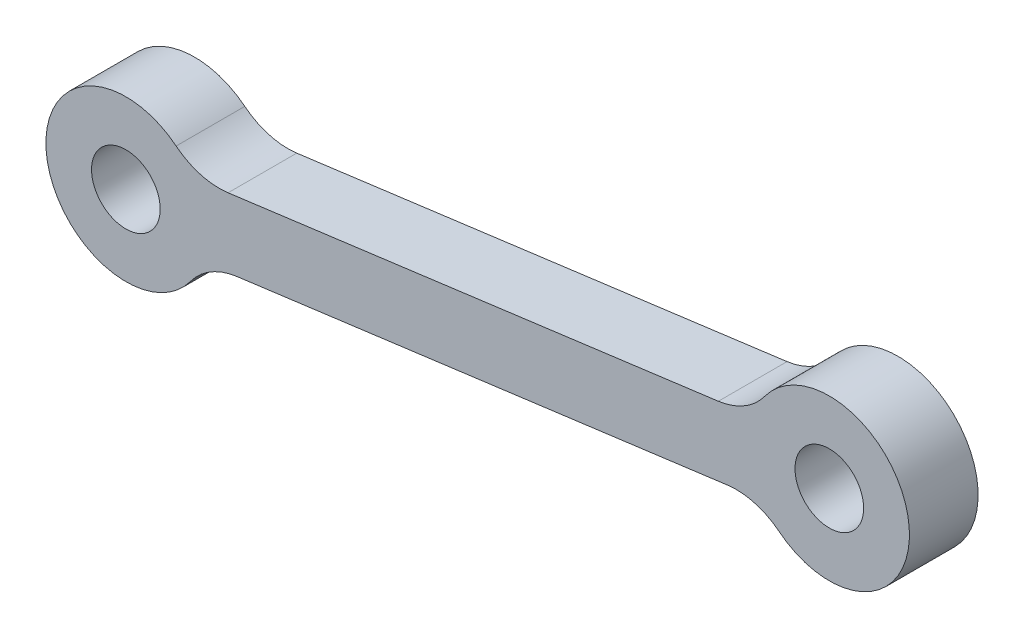
ISO-10303-21;
HEADER;
FILE_DESCRIPTION(('STEP AP214'),'2;1');
FILE_NAME('part.step','',(''),(''),'','','');
FILE_SCHEMA(('AUTOMOTIVE_DESIGN { 1 0 10303 214 1 1 1 1 }'));
ENDSEC;
DATA;
#1=APPLICATION_CONTEXT('core data for automotive mechanical design processes');
#2=APPLICATION_PROTOCOL_DEFINITION('international standard','automotive_design',2000,#1);
#3=PRODUCT_CONTEXT('',#1,'mechanical');
#4=PRODUCT('Part','Part','',(#3));
#5=PRODUCT_RELATED_PRODUCT_CATEGORY('part','',(#4));
#6=PRODUCT_DEFINITION_FORMATION('','',#4);
#7=PRODUCT_DEFINITION_CONTEXT('part definition',#1,'design');
#8=PRODUCT_DEFINITION('design','',#6,#7);
#9=PRODUCT_DEFINITION_SHAPE('','',#8);
#10=(LENGTH_UNIT() NAMED_UNIT(*) SI_UNIT(.MILLI.,.METRE.));
#11=(NAMED_UNIT(*) PLANE_ANGLE_UNIT() SI_UNIT($,.RADIAN.));
#12=(NAMED_UNIT(*) SI_UNIT($,.STERADIAN.) SOLID_ANGLE_UNIT());
#13=UNCERTAINTY_MEASURE_WITH_UNIT(LENGTH_MEASURE(1.E-05),#10,'distance_accuracy_value','');
#14=(GEOMETRIC_REPRESENTATION_CONTEXT(3) GLOBAL_UNCERTAINTY_ASSIGNED_CONTEXT((#13)) GLOBAL_UNIT_ASSIGNED_CONTEXT((#10,
#11,#12)) REPRESENTATION_CONTEXT('',''));
#15=CARTESIAN_POINT('',(0.,0.,0.));
#16=DIRECTION('',(0.,0.,1.));
#17=DIRECTION('',(1.,0.,0.));
#18=AXIS2_PLACEMENT_3D('',#15,#16,#17);
#19=CARTESIAN_POINT('',(-13.4595830446037,-4.64962523375573,-4.35));
#20=DIRECTION('',(0.130663150806389,-0.991426820809961,0.));
#21=DIRECTION('',(0.991426820809961,0.130663150806389,0.));
#22=AXIS2_PLACEMENT_3D('',#19,#20,#21);
#23=PLANE('',#22);
#24=DIRECTION('',(0.991426820809961,0.130663150806389,0.));
#25=VECTOR('',#24,1.);
#26=CARTESIAN_POINT('',(-13.4595830446037,-4.64962523375573,-4.35));
#27=LINE('',#26,#25);
#28=CARTESIAN_POINT('',(-4.61810118370506,-3.48437949549867,-4.35));
#29=VERTEX_POINT('',#28);
#30=CARTESIAN_POINT('',(36.0920293838228,1.88093221288037,-4.35));
#31=VERTEX_POINT('',#30);
#32=EDGE_CURVE('E173',#29,#31,#27,.T.);
#33=ORIENTED_EDGE('',*,*,#32,.T.);
#34=DIRECTION('',(0.,0.,-1.));
#35=VECTOR('',#34,1.);
#36=CARTESIAN_POINT('',(36.0920293838228,1.88093221288037,1.35));
#37=LINE('',#36,#35);
#38=CARTESIAN_POINT('',(36.0920293838228,1.88093221288037,1.35));
#39=VERTEX_POINT('',#38);
#40=EDGE_CURVE('E122',#31,#39,#37,.F.);
#41=ORIENTED_EDGE('',*,*,#40,.T.);
#42=DIRECTION('',(0.991426820809961,0.130663150806389,0.));
#43=VECTOR('',#42,1.);
#44=CARTESIAN_POINT('',(-13.4595830446037,-4.64962523375573,1.35));
#45=LINE('',#44,#43);
#46=CARTESIAN_POINT('',(-4.61810118370506,-3.48437949549867,1.35));
#47=VERTEX_POINT('',#46);
#48=EDGE_CURVE('E109',#47,#39,#45,.T.);
#49=ORIENTED_EDGE('',*,*,#48,.F.);
#50=DIRECTION('',(0.,0.,-1.));
#51=VECTOR('',#50,1.);
#52=CARTESIAN_POINT('',(-4.61810118370506,-3.48437949549867,-4.35));
#53=LINE('',#52,#51);
#54=EDGE_CURVE('E120',#47,#29,#53,.T.);
#55=ORIENTED_EDGE('',*,*,#54,.T.);
#56=EDGE_LOOP('',(#33,#41,#49,#55));
#57=FACE_BOUND('',#56,.T.);
#58=ADVANCED_FACE('F40',(#57),#23,.T.);
#59=CARTESIAN_POINT('',(-13.8191980078423,-1.81417130824589,-4.35));
#60=DIRECTION('',(0.,0.,1.));
#61=DIRECTION('',(1.,0.,0.));
#62=AXIS2_PLACEMENT_3D('',#59,#60,#61);
#63=CYLINDRICAL_SURFACE('',#62,6.65000000000001);
#64=CARTESIAN_POINT('',(-13.8191980078423,-1.81417130824589,-4.35));
#65=DIRECTION('',(0.,0.,1.));
#66=DIRECTION('',(1.,0.,0.));
#67=AXIS2_PLACEMENT_3D('',#64,#65,#66);
#68=CIRCLE('',#67,6.65000000000001);
#69=CARTESIAN_POINT('',(-9.65850046525681,3.37341926533672,-4.35));
#70=VERTEX_POINT('',#69);
#71=CARTESIAN_POINT('',(-8.46372589352418,-5.75643188217565,-4.35));
#72=VERTEX_POINT('',#71);
#73=EDGE_CURVE('E127',#70,#72,#68,.T.);
#74=ORIENTED_EDGE('',*,*,#73,.T.);
#75=DIRECTION('',(0.,0.,1.));
#76=VECTOR('',#75,1.);
#77=CARTESIAN_POINT('',(-8.46372589352418,-5.75643188217565,-4.35));
#78=LINE('',#77,#76);
#79=CARTESIAN_POINT('',(-8.46372589352418,-5.75643188217565,1.35));
#80=VERTEX_POINT('',#79);
#81=EDGE_CURVE('E146',#72,#80,#78,.T.);
#82=ORIENTED_EDGE('',*,*,#81,.T.);
#83=CARTESIAN_POINT('',(-13.8191980078423,-1.81417130824589,1.35));
#84=DIRECTION('',(0.,0.,1.));
#85=DIRECTION('',(1.,0.,0.));
#86=AXIS2_PLACEMENT_3D('',#83,#84,#85);
#87=CIRCLE('',#86,6.65000000000001);
#88=CARTESIAN_POINT('',(-9.65850046525681,3.37341926533672,1.35));
#89=VERTEX_POINT('',#88);
#90=EDGE_CURVE('E110',#89,#80,#87,.T.);
#91=ORIENTED_EDGE('',*,*,#90,.F.);
#92=DIRECTION('',(0.,0.,1.));
#93=VECTOR('',#92,1.);
#94=CARTESIAN_POINT('',(-9.65850046525681,3.37341926533672,-4.35));
#95=LINE('',#94,#93);
#96=EDGE_CURVE('E62',#89,#70,#95,.F.);
#97=ORIENTED_EDGE('',*,*,#96,.T.);
#98=EDGE_LOOP('',(#74,#82,#91,#97));
#99=FACE_BOUND('',#98,.T.);
#100=ADVANCED_FACE('F160',(#99),#63,.T.);
#101=CARTESIAN_POINT('',(-14.2043630042001,1.00150764486105,-4.35));
#102=DIRECTION('',(0.130663150806389,-0.991426820809961,0.));
#103=DIRECTION('',(0.991426820809961,0.130663150806389,0.));
#104=AXIS2_PLACEMENT_3D('',#101,#102,#103);
#105=PLANE('',#104);
#106=DIRECTION('',(0.991426820809961,0.130663150806389,0.));
#107=VECTOR('',#106,1.);
#108=CARTESIAN_POINT('',(-14.2043630042001,1.00150764486105,1.35));
#109=LINE('',#108,#107);
#110=CARTESIAN_POINT('',(-5.34740832630141,2.1687925926479,1.35));
#111=VERTEX_POINT('',#110);
#112=CARTESIAN_POINT('',(35.3472494242264,7.53206509149715,1.35));
#113=VERTEX_POINT('',#112);
#114=EDGE_CURVE('E157',#111,#113,#109,.T.);
#115=ORIENTED_EDGE('',*,*,#114,.T.);
#116=DIRECTION('',(0.,0.,1.));
#117=VECTOR('',#116,1.);
#118=CARTESIAN_POINT('',(35.3472494242264,7.53206509149715,-4.35));
#119=LINE('',#118,#117);
#120=CARTESIAN_POINT('',(35.3472494242264,7.53206509149715,-4.35));
#121=VERTEX_POINT('',#120);
#122=EDGE_CURVE('E143',#113,#121,#119,.F.);
#123=ORIENTED_EDGE('',*,*,#122,.T.);
#124=DIRECTION('',(0.991426820809961,0.130663150806389,0.));
#125=VECTOR('',#124,1.);
#126=CARTESIAN_POINT('',(-14.2043630042001,1.00150764486105,-4.35));
#127=LINE('',#126,#125);
#128=CARTESIAN_POINT('',(-5.34740832630141,2.1687925926479,-4.35));
#129=VERTEX_POINT('',#128);
#130=EDGE_CURVE('E131',#129,#121,#127,.T.);
#131=ORIENTED_EDGE('',*,*,#130,.F.);
#132=DIRECTION('',(0.,0.,1.));
#133=VECTOR('',#132,1.);
#134=CARTESIAN_POINT('',(-5.34740832630141,2.1687925926479,-4.35));
#135=LINE('',#134,#133);
#136=EDGE_CURVE('E140',#129,#111,#135,.T.);
#137=ORIENTED_EDGE('',*,*,#136,.T.);
#138=EDGE_LOOP('',(#115,#123,#131,#137));
#139=FACE_BOUND('',#138,.T.);
#140=ADVANCED_FACE('F168',(#139),#105,.F.);
#141=CARTESIAN_POINT('',(44.5550269755981,5.87094120555266,-4.35));
#142=DIRECTION('',(0.,0.,1.));
#143=DIRECTION('',(1.,0.,0.));
#144=AXIS2_PLACEMENT_3D('',#141,#142,#143);
#145=CYLINDRICAL_SURFACE('',#144,2.85000000000001);
#146=CARTESIAN_POINT('',(44.5550269755981,5.87094120555266,-4.35));
#147=DIRECTION('',(0.,0.,1.));
#148=DIRECTION('',(1.,0.,0.));
#149=AXIS2_PLACEMENT_3D('',#146,#147,#148);
#150=CIRCLE('',#149,2.85000000000001);
#151=CARTESIAN_POINT('',(47.4050269755981,5.87094120555266,-4.35));
#152=VERTEX_POINT('',#151);
#153=EDGE_CURVE('E194',#152,#152,#150,.T.);
#154=ORIENTED_EDGE('',*,*,#153,.F.);
#155=EDGE_LOOP('',(#154));
#156=FACE_BOUND('',#155,.T.);
#157=CARTESIAN_POINT('',(44.5550269755981,5.87094120555266,1.35));
#158=DIRECTION('',(0.,0.,1.));
#159=DIRECTION('',(1.,0.,0.));
#160=AXIS2_PLACEMENT_3D('',#157,#158,#159);
#161=CIRCLE('',#160,2.85000000000001);
#162=CARTESIAN_POINT('',(47.4050269755981,5.87094120555266,1.35));
#163=VERTEX_POINT('',#162);
#164=EDGE_CURVE('E124',#163,#163,#161,.T.);
#165=ORIENTED_EDGE('',*,*,#164,.T.);
#166=EDGE_LOOP('',(#165));
#167=FACE_BOUND('',#166,.T.);
#168=ADVANCED_FACE('F206',(#156,#167),#145,.F.);
#169=CARTESIAN_POINT('',(-13.8319730244019,-1.82405879444734,-4.35));
#170=DIRECTION('',(0.,0.,1.));
#171=DIRECTION('',(1.,0.,0.));
#172=AXIS2_PLACEMENT_3D('',#169,#170,#171);
#173=CYLINDRICAL_SURFACE('',#172,2.85);
#174=CARTESIAN_POINT('',(-13.8319730244019,-1.82405879444734,-4.35));
#175=DIRECTION('',(0.,0.,1.));
#176=DIRECTION('',(1.,0.,0.));
#177=AXIS2_PLACEMENT_3D('',#174,#175,#176);
#178=CIRCLE('',#177,2.85);
#179=CARTESIAN_POINT('',(-10.9819730244019,-1.82405879444734,-4.35));
#180=VERTEX_POINT('',#179);
#181=EDGE_CURVE('E161',#180,#180,#178,.T.);
#182=ORIENTED_EDGE('',*,*,#181,.F.);
#183=EDGE_LOOP('',(#182));
#184=FACE_BOUND('',#183,.T.);
#185=CARTESIAN_POINT('',(-13.8319730244019,-1.82405879444734,1.35));
#186=DIRECTION('',(0.,0.,1.));
#187=DIRECTION('',(1.,0.,0.));
#188=AXIS2_PLACEMENT_3D('',#185,#186,#187);
#189=CIRCLE('',#188,2.85);
#190=CARTESIAN_POINT('',(-10.9819730244019,-1.82405879444734,1.35));
#191=VERTEX_POINT('',#190);
#192=EDGE_CURVE('E177',#191,#191,#189,.T.);
#193=ORIENTED_EDGE('',*,*,#192,.T.);
#194=EDGE_LOOP('',(#193));
#195=FACE_BOUND('',#194,.T.);
#196=ADVANCED_FACE('F203',(#184,#195),#173,.F.);
#197=CARTESIAN_POINT('',(44.5550269755981,5.87094120555266,-4.35));
#198=DIRECTION('',(0.,0.,1.));
#199=DIRECTION('',(1.,0.,0.));
#200=AXIS2_PLACEMENT_3D('',#197,#198,#199);
#201=CYLINDRICAL_SURFACE('',#200,6.65);
#202=CARTESIAN_POINT('',(44.5550269755981,5.87094120555266,1.35));
#203=DIRECTION('',(0.,0.,1.));
#204=DIRECTION('',(1.,0.,0.));
#205=AXIS2_PLACEMENT_3D('',#202,#203,#204);
#206=CIRCLE('',#205,6.65);
#207=CARTESIAN_POINT('',(40.3990636351941,0.679557121012389,1.35));
#208=VERTEX_POINT('',#207);
#209=CARTESIAN_POINT('',(39.1959575466152,9.80831023262411,1.35));
#210=VERTEX_POINT('',#209);
#211=EDGE_CURVE('E123',#208,#210,#206,.T.);
#212=ORIENTED_EDGE('',*,*,#211,.F.);
#213=DIRECTION('',(0.,0.,1.));
#214=VECTOR('',#213,1.);
#215=CARTESIAN_POINT('',(40.3990636351941,0.679557121012389,-4.35));
#216=LINE('',#215,#214);
#217=CARTESIAN_POINT('',(40.3990636351941,0.679557121012389,-4.35));
#218=VERTEX_POINT('',#217);
#219=EDGE_CURVE('E138',#208,#218,#216,.F.);
#220=ORIENTED_EDGE('',*,*,#219,.T.);
#221=CARTESIAN_POINT('',(44.5550269755981,5.87094120555266,-4.35));
#222=DIRECTION('',(0.,0.,1.));
#223=DIRECTION('',(1.,0.,0.));
#224=AXIS2_PLACEMENT_3D('',#221,#222,#223);
#225=CIRCLE('',#224,6.65);
#226=CARTESIAN_POINT('',(39.1959575466152,9.80831023262411,-4.35));
#227=VERTEX_POINT('',#226);
#228=EDGE_CURVE('E170',#218,#227,#225,.T.);
#229=ORIENTED_EDGE('',*,*,#228,.T.);
#230=DIRECTION('',(0.,0.,1.));
#231=VECTOR('',#230,1.);
#232=CARTESIAN_POINT('',(39.1959575466152,9.80831023262411,-4.35));
#233=LINE('',#232,#231);
#234=EDGE_CURVE('E129',#227,#210,#233,.T.);
#235=ORIENTED_EDGE('',*,*,#234,.T.);
#236=EDGE_LOOP('',(#212,#220,#229,#235));
#237=FACE_BOUND('',#236,.T.);
#238=ADVANCED_FACE('F190',(#237),#201,.T.);
#239=CARTESIAN_POINT('',(-13.8319730244019,-1.82405879444734,-4.35));
#240=DIRECTION('',(0.,0.,1.));
#241=DIRECTION('',(1.,0.,0.));
#242=AXIS2_PLACEMENT_3D('',#239,#240,#241);
#243=PLANE('',#242);
#244=ORIENTED_EDGE('',*,*,#181,.T.);
#245=EDGE_LOOP('',(#244));
#246=FACE_BOUND('',#245,.T.);
#247=ORIENTED_EDGE('',*,*,#153,.T.);
#248=EDGE_LOOP('',(#247));
#249=FACE_BOUND('',#248,.T.);
#250=ORIENTED_EDGE('',*,*,#32,.F.);
#251=CARTESIAN_POINT('',(-3.87332122410864,-9.13551237411544,-4.35));
#252=DIRECTION('',(0.,0.,1.));
#253=DIRECTION('',(1.,0.,0.));
#254=AXIS2_PLACEMENT_3D('',#251,#252,#253);
#255=CIRCLE('',#254,5.7);
#256=EDGE_CURVE('E55',#29,#72,#255,.T.);
#257=ORIENTED_EDGE('',*,*,#256,.T.);
#258=ORIENTED_EDGE('',*,*,#73,.F.);
#259=CARTESIAN_POINT('',(-6.09218828589783,7.81992547126467,-4.35));
#260=DIRECTION('',(0.,0.,1.));
#261=DIRECTION('',(1.,0.,0.));
#262=AXIS2_PLACEMENT_3D('',#259,#260,#261);
#263=CIRCLE('',#262,5.7);
#264=EDGE_CURVE('E11',#70,#129,#263,.T.);
#265=ORIENTED_EDGE('',*,*,#264,.T.);
#266=ORIENTED_EDGE('',*,*,#130,.T.);
#267=CARTESIAN_POINT('',(34.60246946463,13.1831979701139,-4.35));
#268=DIRECTION('',(0.,0.,1.));
#269=DIRECTION('',(1.,0.,0.));
#270=AXIS2_PLACEMENT_3D('',#267,#268,#269);
#271=CIRCLE('',#270,5.7);
#272=EDGE_CURVE('E115',#121,#227,#271,.T.);
#273=ORIENTED_EDGE('',*,*,#272,.T.);
#274=ORIENTED_EDGE('',*,*,#228,.F.);
#275=CARTESIAN_POINT('',(36.8368093434192,-3.77020066573641,-4.35));
#276=DIRECTION('',(0.,0.,1.));
#277=DIRECTION('',(1.,0.,0.));
#278=AXIS2_PLACEMENT_3D('',#275,#276,#277);
#279=CIRCLE('',#278,5.7);
#280=EDGE_CURVE('E150',#218,#31,#279,.T.);
#281=ORIENTED_EDGE('',*,*,#280,.T.);
#282=EDGE_LOOP('',(#250,#257,#258,#265,#266,#273,#274,#281));
#283=FACE_BOUND('',#282,.T.);
#284=ADVANCED_FACE('F165',(#246,#249,#283),#243,.F.);
#285=CARTESIAN_POINT('',(-13.8319730244019,-1.82405879444734,1.35));
#286=DIRECTION('',(0.,0.,1.));
#287=DIRECTION('',(1.,0.,0.));
#288=AXIS2_PLACEMENT_3D('',#285,#286,#287);
#289=PLANE('',#288);
#290=ORIENTED_EDGE('',*,*,#192,.F.);
#291=EDGE_LOOP('',(#290));
#292=FACE_BOUND('',#291,.T.);
#293=ORIENTED_EDGE('',*,*,#164,.F.);
#294=EDGE_LOOP('',(#293));
#295=FACE_BOUND('',#294,.T.);
#296=ORIENTED_EDGE('',*,*,#90,.T.);
#297=CARTESIAN_POINT('',(-3.87332122410864,-9.13551237411544,1.35));
#298=DIRECTION('',(0.,0.,1.));
#299=DIRECTION('',(1.,0.,0.));
#300=AXIS2_PLACEMENT_3D('',#297,#298,#299);
#301=CIRCLE('',#300,5.7);
#302=EDGE_CURVE('E106',#80,#47,#301,.F.);
#303=ORIENTED_EDGE('',*,*,#302,.T.);
#304=ORIENTED_EDGE('',*,*,#48,.T.);
#305=CARTESIAN_POINT('',(36.8368093434192,-3.77020066573641,1.35));
#306=DIRECTION('',(0.,0.,1.));
#307=DIRECTION('',(1.,0.,0.));
#308=AXIS2_PLACEMENT_3D('',#305,#306,#307);
#309=CIRCLE('',#308,5.7);
#310=EDGE_CURVE('E148',#39,#208,#309,.F.);
#311=ORIENTED_EDGE('',*,*,#310,.T.);
#312=ORIENTED_EDGE('',*,*,#211,.T.);
#313=CARTESIAN_POINT('',(34.60246946463,13.1831979701139,1.35));
#314=DIRECTION('',(0.,0.,1.));
#315=DIRECTION('',(1.,0.,0.));
#316=AXIS2_PLACEMENT_3D('',#313,#314,#315);
#317=CIRCLE('',#316,5.7);
#318=EDGE_CURVE('E152',#210,#113,#317,.F.);
#319=ORIENTED_EDGE('',*,*,#318,.T.);
#320=ORIENTED_EDGE('',*,*,#114,.F.);
#321=CARTESIAN_POINT('',(-6.09218828589783,7.81992547126467,1.35));
#322=DIRECTION('',(0.,0.,1.));
#323=DIRECTION('',(1.,0.,0.));
#324=AXIS2_PLACEMENT_3D('',#321,#322,#323);
#325=CIRCLE('',#324,5.7);
#326=EDGE_CURVE('E48',#111,#89,#325,.F.);
#327=ORIENTED_EDGE('',*,*,#326,.T.);
#328=EDGE_LOOP('',(#296,#303,#304,#311,#312,#319,#320,#327));
#329=FACE_BOUND('',#328,.T.);
#330=ADVANCED_FACE('F108',(#292,#295,#329),#289,.T.);
#331=CARTESIAN_POINT('',(36.8368093434192,-3.77020066573641,-4.35));
#332=DIRECTION('',(0.,0.,1.));
#333=DIRECTION('',(1.,0.,0.));
#334=AXIS2_PLACEMENT_3D('',#331,#332,#333);
#335=CYLINDRICAL_SURFACE('',#334,5.7);
#336=ORIENTED_EDGE('',*,*,#280,.F.);
#337=ORIENTED_EDGE('',*,*,#219,.F.);
#338=ORIENTED_EDGE('',*,*,#310,.F.);
#339=ORIENTED_EDGE('',*,*,#40,.F.);
#340=EDGE_LOOP('',(#336,#337,#338,#339));
#341=FACE_BOUND('',#340,.T.);
#342=ADVANCED_FACE('F193',(#341),#335,.F.);
#343=CARTESIAN_POINT('',(34.60246946463,13.1831979701139,-4.35));
#344=DIRECTION('',(0.,0.,1.));
#345=DIRECTION('',(1.,0.,0.));
#346=AXIS2_PLACEMENT_3D('',#343,#344,#345);
#347=CYLINDRICAL_SURFACE('',#346,5.7);
#348=ORIENTED_EDGE('',*,*,#272,.F.);
#349=ORIENTED_EDGE('',*,*,#122,.F.);
#350=ORIENTED_EDGE('',*,*,#318,.F.);
#351=ORIENTED_EDGE('',*,*,#234,.F.);
#352=EDGE_LOOP('',(#348,#349,#350,#351));
#353=FACE_BOUND('',#352,.T.);
#354=ADVANCED_FACE('F184',(#353),#347,.F.);
#355=CARTESIAN_POINT('',(-3.87332122410864,-9.13551237411544,-4.35));
#356=DIRECTION('',(0.,0.,1.));
#357=DIRECTION('',(1.,0.,0.));
#358=AXIS2_PLACEMENT_3D('',#355,#356,#357);
#359=CYLINDRICAL_SURFACE('',#358,5.7);
#360=ORIENTED_EDGE('',*,*,#256,.F.);
#361=ORIENTED_EDGE('',*,*,#54,.F.);
#362=ORIENTED_EDGE('',*,*,#302,.F.);
#363=ORIENTED_EDGE('',*,*,#81,.F.);
#364=EDGE_LOOP('',(#360,#361,#362,#363));
#365=FACE_BOUND('',#364,.T.);
#366=ADVANCED_FACE('F126',(#365),#359,.F.);
#367=CARTESIAN_POINT('',(-6.09218828589783,7.81992547126467,-4.35));
#368=DIRECTION('',(0.,0.,1.));
#369=DIRECTION('',(1.,0.,0.));
#370=AXIS2_PLACEMENT_3D('',#367,#368,#369);
#371=CYLINDRICAL_SURFACE('',#370,5.7);
#372=ORIENTED_EDGE('',*,*,#264,.F.);
#373=ORIENTED_EDGE('',*,*,#96,.F.);
#374=ORIENTED_EDGE('',*,*,#326,.F.);
#375=ORIENTED_EDGE('',*,*,#136,.F.);
#376=EDGE_LOOP('',(#372,#373,#374,#375));
#377=FACE_BOUND('',#376,.T.);
#378=ADVANCED_FACE('F42',(#377),#371,.F.);
#379=CLOSED_SHELL('',(#58,#100,#140,#168,#196,#238,#284,#330,#342,#354,#366,#378));
#380=MANIFOLD_SOLID_BREP('B2',#379);
#381=ADVANCED_BREP_SHAPE_REPRESENTATION('',(#18,#380),#14);
#382=SHAPE_DEFINITION_REPRESENTATION(#9,#381);
ENDSEC;
END-ISO-10303-21;
